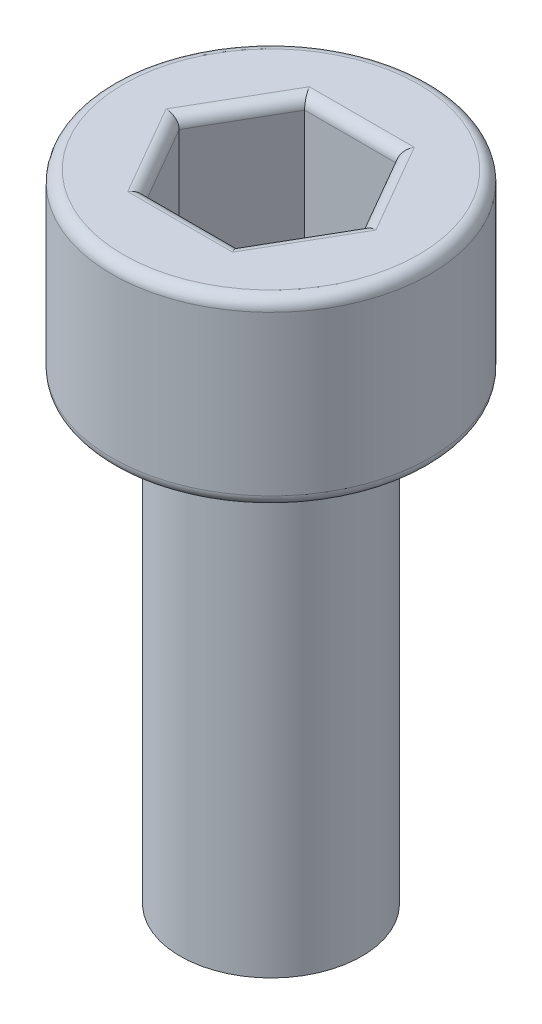
ISO-10303-21;
HEADER;
FILE_DESCRIPTION(('STEP AP214'),'2;1');
FILE_NAME('part.step','',(''),(''),'','','');
FILE_SCHEMA(('AUTOMOTIVE_DESIGN { 1 0 10303 214 1 1 1 1 }'));
ENDSEC;
DATA;
#1=APPLICATION_CONTEXT('core data for automotive mechanical design processes');
#2=APPLICATION_PROTOCOL_DEFINITION('international standard','automotive_design',2000,#1);
#3=PRODUCT_CONTEXT('',#1,'mechanical');
#4=PRODUCT('Part','Part','',(#3));
#5=PRODUCT_RELATED_PRODUCT_CATEGORY('part','',(#4));
#6=PRODUCT_DEFINITION_FORMATION('','',#4);
#7=PRODUCT_DEFINITION_CONTEXT('part definition',#1,'design');
#8=PRODUCT_DEFINITION('design','',#6,#7);
#9=PRODUCT_DEFINITION_SHAPE('','',#8);
#10=(LENGTH_UNIT() NAMED_UNIT(*) SI_UNIT(.MILLI.,.METRE.));
#11=(NAMED_UNIT(*) PLANE_ANGLE_UNIT() SI_UNIT($,.RADIAN.));
#12=(NAMED_UNIT(*) SI_UNIT($,.STERADIAN.) SOLID_ANGLE_UNIT());
#13=UNCERTAINTY_MEASURE_WITH_UNIT(LENGTH_MEASURE(1.E-05),#10,'distance_accuracy_value','');
#14=(GEOMETRIC_REPRESENTATION_CONTEXT(3) GLOBAL_UNCERTAINTY_ASSIGNED_CONTEXT((#13)) GLOBAL_UNIT_ASSIGNED_CONTEXT((#10,
#11,#12)) REPRESENTATION_CONTEXT('',''));
#15=CARTESIAN_POINT('',(0.,0.,0.));
#16=DIRECTION('',(0.,0.,1.));
#17=DIRECTION('',(1.,0.,0.));
#18=AXIS2_PLACEMENT_3D('',#15,#16,#17);
#19=CARTESIAN_POINT('',(2.44935223975043E-11,4.,0.));
#20=DIRECTION('',(0.,-1.,0.));
#21=DIRECTION('',(1.,0.,0.));
#22=AXIS2_PLACEMENT_3D('',#19,#20,#21);
#23=PLANE('',#22);
#24=CARTESIAN_POINT('',(0.,4.,0.));
#25=DIRECTION('',(0.,-1.,0.));
#26=DIRECTION('',(1.,0.,0.));
#27=AXIS2_PLACEMENT_3D('',#24,#25,#26);
#28=CIRCLE('',#27,3.25000000002449);
#29=CARTESIAN_POINT('',(3.25000000002449,4.,0.));
#30=VERTEX_POINT('',#29);
#31=EDGE_CURVE('E179',#30,#30,#28,.F.);
#32=ORIENTED_EDGE('',*,*,#31,.T.);
#33=EDGE_LOOP('',(#32));
#34=FACE_BOUND('',#33,.T.);
#35=DIRECTION('',(-0.5,0.,0.866025403784439));
#36=VECTOR('',#35,1.);
#37=CARTESIAN_POINT('',(-1.73205080756275,4.,-1.00000000001061));
#38=LINE('',#37,#36);
#39=CARTESIAN_POINT('',(-2.3094010767585,4.,0.));
#40=VERTEX_POINT('',#39);
#41=CARTESIAN_POINT('',(-1.15470053837925,4.,-2.));
#42=VERTEX_POINT('',#41);
#43=EDGE_CURVE('E174',#40,#42,#38,.F.);
#44=ORIENTED_EDGE('',*,*,#43,.T.);
#45=DIRECTION('',(-1.,0.,0.));
#46=VECTOR('',#45,1.);
#47=CARTESIAN_POINT('',(2.44941662466181E-11,4.,-2.));
#48=LINE('',#47,#46);
#49=CARTESIAN_POINT('',(1.15470053837925,4.,-2.));
#50=VERTEX_POINT('',#49);
#51=EDGE_CURVE('E176',#42,#50,#48,.F.);
#52=ORIENTED_EDGE('',*,*,#51,.T.);
#53=DIRECTION('',(-0.5,0.,-0.866025403784439));
#54=VECTOR('',#53,1.);
#55=CARTESIAN_POINT('',(1.732050807575,4.,-0.999999999989394));
#56=LINE('',#55,#54);
#57=CARTESIAN_POINT('',(2.3094010767585,4.,0.));
#58=VERTEX_POINT('',#57);
#59=EDGE_CURVE('E166',#50,#58,#56,.F.);
#60=ORIENTED_EDGE('',*,*,#59,.T.);
#61=DIRECTION('',(0.5,0.,-0.866025403784439));
#62=VECTOR('',#61,1.);
#63=CARTESIAN_POINT('',(1.732050807575,4.,0.999999999989394));
#64=LINE('',#63,#62);
#65=CARTESIAN_POINT('',(1.15470053837925,4.,2.));
#66=VERTEX_POINT('',#65);
#67=EDGE_CURVE('E168',#58,#66,#64,.F.);
#68=ORIENTED_EDGE('',*,*,#67,.T.);
#69=DIRECTION('',(1.,0.,0.));
#70=VECTOR('',#69,1.);
#71=CARTESIAN_POINT('',(2.44924493156481E-11,4.,2.));
#72=LINE('',#71,#70);
#73=CARTESIAN_POINT('',(-1.15470053837925,4.,2.));
#74=VERTEX_POINT('',#73);
#75=EDGE_CURVE('E170',#66,#74,#72,.F.);
#76=ORIENTED_EDGE('',*,*,#75,.T.);
#77=DIRECTION('',(0.5,0.,0.866025403784439));
#78=VECTOR('',#77,1.);
#79=CARTESIAN_POINT('',(-1.73205080756276,4.,1.00000000001061));
#80=LINE('',#79,#78);
#81=EDGE_CURVE('E172',#74,#40,#80,.F.);
#82=ORIENTED_EDGE('',*,*,#81,.T.);
#83=EDGE_LOOP('',(#44,#52,#60,#68,#76,#82));
#84=FACE_BOUND('',#83,.T.);
#85=ADVANCED_FACE('F33',(#34,#84),#23,.F.);
#86=CARTESIAN_POINT('',(0.,21.3223243250921,0.));
#87=DIRECTION('',(0.,1.,0.));
#88=DIRECTION('',(-1.,0.,0.));
#89=AXIS2_PLACEMENT_3D('',#86,#87,#88);
#90=CYLINDRICAL_SURFACE('',#89,3.50000000002449);
#91=CARTESIAN_POINT('',(0.,0.25,0.));
#92=DIRECTION('',(0.,1.,0.));
#93=DIRECTION('',(-1.,0.,0.));
#94=AXIS2_PLACEMENT_3D('',#91,#92,#93);
#95=CIRCLE('',#94,3.50000000002449);
#96=CARTESIAN_POINT('',(-3.50000000002449,0.25,0.));
#97=VERTEX_POINT('',#96);
#98=EDGE_CURVE('E163',#97,#97,#95,.T.);
#99=ORIENTED_EDGE('',*,*,#98,.T.);
#100=EDGE_LOOP('',(#99));
#101=FACE_BOUND('',#100,.T.);
#102=CARTESIAN_POINT('',(0.,3.75,0.));
#103=DIRECTION('',(0.,-1.,0.));
#104=DIRECTION('',(1.,0.,0.));
#105=AXIS2_PLACEMENT_3D('',#102,#103,#104);
#106=CIRCLE('',#105,3.50000000002449);
#107=CARTESIAN_POINT('',(3.50000000002449,3.75,0.));
#108=VERTEX_POINT('',#107);
#109=EDGE_CURVE('E160',#108,#108,#106,.T.);
#110=ORIENTED_EDGE('',*,*,#109,.T.);
#111=EDGE_LOOP('',(#110));
#112=FACE_BOUND('',#111,.T.);
#113=ADVANCED_FACE('F240',(#101,#112),#90,.T.);
#114=CARTESIAN_POINT('',(3.50000000002449,0.,0.));
#115=DIRECTION('',(0.,1.,0.));
#116=DIRECTION('',(-1.,0.,0.));
#117=AXIS2_PLACEMENT_3D('',#114,#115,#116);
#118=PLANE('',#117);
#119=CARTESIAN_POINT('',(0.,0.,0.));
#120=DIRECTION('',(0.,1.,0.));
#121=DIRECTION('',(-1.,0.,0.));
#122=AXIS2_PLACEMENT_3D('',#119,#120,#121);
#123=CIRCLE('',#122,2.25);
#124=CARTESIAN_POINT('',(-2.25,0.,0.));
#125=VERTEX_POINT('',#124);
#126=EDGE_CURVE('E154',#125,#125,#123,.T.);
#127=ORIENTED_EDGE('',*,*,#126,.T.);
#128=EDGE_LOOP('',(#127));
#129=FACE_BOUND('',#128,.T.);
#130=CARTESIAN_POINT('',(0.,0.,0.));
#131=DIRECTION('',(0.,1.,0.));
#132=DIRECTION('',(-1.,0.,0.));
#133=AXIS2_PLACEMENT_3D('',#130,#131,#132);
#134=CIRCLE('',#133,3.25000000002449);
#135=CARTESIAN_POINT('',(-3.25000000002449,0.,0.));
#136=VERTEX_POINT('',#135);
#137=EDGE_CURVE('E151',#136,#136,#134,.F.);
#138=ORIENTED_EDGE('',*,*,#137,.T.);
#139=EDGE_LOOP('',(#138));
#140=FACE_BOUND('',#139,.T.);
#141=ADVANCED_FACE('F246',(#129,#140),#118,.F.);
#142=CARTESIAN_POINT('',(0.,21.3223243250921,0.));
#143=DIRECTION('',(0.,1.,0.));
#144=DIRECTION('',(-1.,0.,0.));
#145=AXIS2_PLACEMENT_3D('',#142,#143,#144);
#146=CYLINDRICAL_SURFACE('',#145,2.);
#147=CARTESIAN_POINT('',(0.,-0.25,0.));
#148=DIRECTION('',(0.,1.,0.));
#149=DIRECTION('',(-1.,0.,0.));
#150=AXIS2_PLACEMENT_3D('',#147,#148,#149);
#151=CIRCLE('',#150,2.);
#152=CARTESIAN_POINT('',(-2.,-0.25,0.));
#153=VERTEX_POINT('',#152);
#154=EDGE_CURVE('E157',#153,#153,#151,.F.);
#155=ORIENTED_EDGE('',*,*,#154,.T.);
#156=EDGE_LOOP('',(#155));
#157=FACE_BOUND('',#156,.T.);
#158=CARTESIAN_POINT('',(0.,-10.,0.));
#159=DIRECTION('',(0.,1.,0.));
#160=DIRECTION('',(-1.,0.,0.));
#161=AXIS2_PLACEMENT_3D('',#158,#159,#160);
#162=CIRCLE('',#161,2.);
#163=CARTESIAN_POINT('',(-2.,-10.,0.));
#164=VERTEX_POINT('',#163);
#165=EDGE_CURVE('E139',#164,#164,#162,.T.);
#166=ORIENTED_EDGE('',*,*,#165,.T.);
#167=EDGE_LOOP('',(#166));
#168=FACE_BOUND('',#167,.T.);
#169=ADVANCED_FACE('F338',(#157,#168),#146,.T.);
#170=CARTESIAN_POINT('',(2.,-10.,0.));
#171=DIRECTION('',(0.,1.,0.));
#172=DIRECTION('',(-1.,0.,0.));
#173=AXIS2_PLACEMENT_3D('',#170,#171,#172);
#174=PLANE('',#173);
#175=ORIENTED_EDGE('',*,*,#165,.F.);
#176=EDGE_LOOP('',(#175));
#177=FACE_BOUND('',#176,.T.);
#178=ADVANCED_FACE('F236',(#177),#174,.F.);
#179=CARTESIAN_POINT('',(1.01036297108184,1.,1.75));
#180=DIRECTION('',(0.866025403784439,0.,0.5));
#181=DIRECTION('',(0.5,0.,-0.866025403784439));
#182=AXIS2_PLACEMENT_3D('',#179,#180,#181);
#183=PLANE('',#182);
#184=DIRECTION('',(0.,1.,0.));
#185=VECTOR('',#184,1.);
#186=CARTESIAN_POINT('',(1.01036297108184,1.,1.75));
#187=LINE('',#186,#185);
#188=CARTESIAN_POINT('',(1.01036297108184,1.,1.75));
#189=VERTEX_POINT('',#188);
#190=CARTESIAN_POINT('',(1.01036297108184,3.75,1.75));
#191=VERTEX_POINT('',#190);
#192=EDGE_CURVE('E137',#189,#191,#187,.T.);
#193=ORIENTED_EDGE('',*,*,#192,.T.);
#194=DIRECTION('',(0.5,0.,-0.866025403784439));
#195=VECTOR('',#194,1.);
#196=CARTESIAN_POINT('',(1.01036297108184,3.75,1.75));
#197=LINE('',#196,#195);
#198=CARTESIAN_POINT('',(2.02072594216369,3.75,0.));
#199=VERTEX_POINT('',#198);
#200=EDGE_CURVE('E42',#191,#199,#197,.T.);
#201=ORIENTED_EDGE('',*,*,#200,.T.);
#202=DIRECTION('',(0.,1.,0.));
#203=VECTOR('',#202,1.);
#204=CARTESIAN_POINT('',(2.02072594216369,1.,0.));
#205=LINE('',#204,#203);
#206=CARTESIAN_POINT('',(2.02072594216369,1.,0.));
#207=VERTEX_POINT('',#206);
#208=EDGE_CURVE('E103',#207,#199,#205,.T.);
#209=ORIENTED_EDGE('',*,*,#208,.F.);
#210=DIRECTION('',(0.5,0.,-0.866025403784439));
#211=VECTOR('',#210,1.);
#212=CARTESIAN_POINT('',(1.01036297108184,1.,1.75));
#213=LINE('',#212,#211);
#214=EDGE_CURVE('E107',#189,#207,#213,.T.);
#215=ORIENTED_EDGE('',*,*,#214,.F.);
#216=EDGE_LOOP('',(#193,#201,#209,#215));
#217=FACE_BOUND('',#216,.T.);
#218=ADVANCED_FACE('F105',(#217),#183,.F.);
#219=CARTESIAN_POINT('',(-1.01036297108185,1.,1.75));
#220=DIRECTION('',(0.,0.,1.));
#221=DIRECTION('',(1.,0.,0.));
#222=AXIS2_PLACEMENT_3D('',#219,#220,#221);
#223=PLANE('',#222);
#224=DIRECTION('',(0.,1.,0.));
#225=VECTOR('',#224,1.);
#226=CARTESIAN_POINT('',(-1.01036297108185,1.,1.75));
#227=LINE('',#226,#225);
#228=CARTESIAN_POINT('',(-1.01036297108185,1.,1.75));
#229=VERTEX_POINT('',#228);
#230=CARTESIAN_POINT('',(-1.01036297108185,3.75,1.75));
#231=VERTEX_POINT('',#230);
#232=EDGE_CURVE('E140',#229,#231,#227,.T.);
#233=ORIENTED_EDGE('',*,*,#232,.T.);
#234=DIRECTION('',(1.,0.,0.));
#235=VECTOR('',#234,1.);
#236=CARTESIAN_POINT('',(-1.01036297108185,3.75,1.75));
#237=LINE('',#236,#235);
#238=EDGE_CURVE('E57',#231,#191,#237,.T.);
#239=ORIENTED_EDGE('',*,*,#238,.T.);
#240=ORIENTED_EDGE('',*,*,#192,.F.);
#241=DIRECTION('',(1.,0.,0.));
#242=VECTOR('',#241,1.);
#243=CARTESIAN_POINT('',(-1.01036297108185,1.,1.75));
#244=LINE('',#243,#242);
#245=EDGE_CURVE('E112',#229,#189,#244,.T.);
#246=ORIENTED_EDGE('',*,*,#245,.F.);
#247=EDGE_LOOP('',(#233,#239,#240,#246));
#248=FACE_BOUND('',#247,.T.);
#249=ADVANCED_FACE('F228',(#248),#223,.F.);
#250=CARTESIAN_POINT('',(-2.02072594216369,1.,0.));
#251=DIRECTION('',(-0.866025403784439,0.,0.5));
#252=DIRECTION('',(0.5,0.,0.866025403784439));
#253=AXIS2_PLACEMENT_3D('',#250,#251,#252);
#254=PLANE('',#253);
#255=DIRECTION('',(0.,1.,0.));
#256=VECTOR('',#255,1.);
#257=CARTESIAN_POINT('',(-2.02072594216369,1.,0.));
#258=LINE('',#257,#256);
#259=CARTESIAN_POINT('',(-2.02072594216369,1.,0.));
#260=VERTEX_POINT('',#259);
#261=CARTESIAN_POINT('',(-2.02072594216369,3.75,0.));
#262=VERTEX_POINT('',#261);
#263=EDGE_CURVE('E142',#260,#262,#258,.T.);
#264=ORIENTED_EDGE('',*,*,#263,.T.);
#265=DIRECTION('',(0.5,0.,0.866025403784439));
#266=VECTOR('',#265,1.);
#267=CARTESIAN_POINT('',(-2.02072594216369,3.75,0.));
#268=LINE('',#267,#266);
#269=EDGE_CURVE('E187',#262,#231,#268,.T.);
#270=ORIENTED_EDGE('',*,*,#269,.T.);
#271=ORIENTED_EDGE('',*,*,#232,.F.);
#272=DIRECTION('',(0.5,0.,0.866025403784439));
#273=VECTOR('',#272,1.);
#274=CARTESIAN_POINT('',(-2.02072594216369,1.,0.));
#275=LINE('',#274,#273);
#276=EDGE_CURVE('E134',#260,#229,#275,.T.);
#277=ORIENTED_EDGE('',*,*,#276,.F.);
#278=EDGE_LOOP('',(#264,#270,#271,#277));
#279=FACE_BOUND('',#278,.T.);
#280=ADVANCED_FACE('F227',(#279),#254,.F.);
#281=CARTESIAN_POINT('',(-1.01036297108185,1.,-1.75));
#282=DIRECTION('',(-0.866025403784439,0.,-0.5));
#283=DIRECTION('',(-0.5,0.,0.866025403784439));
#284=AXIS2_PLACEMENT_3D('',#281,#282,#283);
#285=PLANE('',#284);
#286=DIRECTION('',(0.,1.,0.));
#287=VECTOR('',#286,1.);
#288=CARTESIAN_POINT('',(-1.01036297108185,1.,-1.75));
#289=LINE('',#288,#287);
#290=CARTESIAN_POINT('',(-1.01036297108185,1.,-1.75));
#291=VERTEX_POINT('',#290);
#292=CARTESIAN_POINT('',(-1.01036297108185,3.75,-1.75));
#293=VERTEX_POINT('',#292);
#294=EDGE_CURVE('E145',#291,#293,#289,.T.);
#295=ORIENTED_EDGE('',*,*,#294,.T.);
#296=DIRECTION('',(-0.5,0.,0.866025403784439));
#297=VECTOR('',#296,1.);
#298=CARTESIAN_POINT('',(-1.01036297108185,3.75,-1.75));
#299=LINE('',#298,#297);
#300=EDGE_CURVE('E185',#293,#262,#299,.T.);
#301=ORIENTED_EDGE('',*,*,#300,.T.);
#302=ORIENTED_EDGE('',*,*,#263,.F.);
#303=DIRECTION('',(-0.5,0.,0.866025403784439));
#304=VECTOR('',#303,1.);
#305=CARTESIAN_POINT('',(-1.01036297108185,1.,-1.75));
#306=LINE('',#305,#304);
#307=EDGE_CURVE('E131',#291,#260,#306,.T.);
#308=ORIENTED_EDGE('',*,*,#307,.F.);
#309=EDGE_LOOP('',(#295,#301,#302,#308));
#310=FACE_BOUND('',#309,.T.);
#311=ADVANCED_FACE('F224',(#310),#285,.F.);
#312=CARTESIAN_POINT('',(1.01036297108185,1.,-1.75));
#313=DIRECTION('',(0.,0.,-1.));
#314=DIRECTION('',(-1.,0.,0.));
#315=AXIS2_PLACEMENT_3D('',#312,#313,#314);
#316=PLANE('',#315);
#317=DIRECTION('',(0.,1.,0.));
#318=VECTOR('',#317,1.);
#319=CARTESIAN_POINT('',(1.01036297108185,1.,-1.75));
#320=LINE('',#319,#318);
#321=CARTESIAN_POINT('',(1.01036297108185,1.,-1.75));
#322=VERTEX_POINT('',#321);
#323=CARTESIAN_POINT('',(1.01036297108184,3.75,-1.75));
#324=VERTEX_POINT('',#323);
#325=EDGE_CURVE('E111',#322,#324,#320,.T.);
#326=ORIENTED_EDGE('',*,*,#325,.T.);
#327=DIRECTION('',(-1.,0.,0.));
#328=VECTOR('',#327,1.);
#329=CARTESIAN_POINT('',(1.01036297108184,3.75,-1.75));
#330=LINE('',#329,#328);
#331=EDGE_CURVE('E182',#324,#293,#330,.T.);
#332=ORIENTED_EDGE('',*,*,#331,.T.);
#333=ORIENTED_EDGE('',*,*,#294,.F.);
#334=DIRECTION('',(-1.,0.,0.));
#335=VECTOR('',#334,1.);
#336=CARTESIAN_POINT('',(1.01036297108185,1.,-1.75));
#337=LINE('',#336,#335);
#338=EDGE_CURVE('E121',#322,#291,#337,.T.);
#339=ORIENTED_EDGE('',*,*,#338,.F.);
#340=EDGE_LOOP('',(#326,#332,#333,#339));
#341=FACE_BOUND('',#340,.T.);
#342=ADVANCED_FACE('F220',(#341),#316,.F.);
#343=CARTESIAN_POINT('',(2.02072594216369,1.,0.));
#344=DIRECTION('',(0.866025403784439,0.,-0.5));
#345=DIRECTION('',(-0.5,0.,-0.866025403784439));
#346=AXIS2_PLACEMENT_3D('',#343,#344,#345);
#347=PLANE('',#346);
#348=ORIENTED_EDGE('',*,*,#208,.T.);
#349=DIRECTION('',(-0.5,0.,-0.866025403784439));
#350=VECTOR('',#349,1.);
#351=CARTESIAN_POINT('',(2.02072594216369,3.75,0.));
#352=LINE('',#351,#350);
#353=EDGE_CURVE('E11',#199,#324,#352,.T.);
#354=ORIENTED_EDGE('',*,*,#353,.T.);
#355=ORIENTED_EDGE('',*,*,#325,.F.);
#356=DIRECTION('',(-0.5,0.,-0.866025403784439));
#357=VECTOR('',#356,1.);
#358=CARTESIAN_POINT('',(2.02072594216369,1.,0.));
#359=LINE('',#358,#357);
#360=EDGE_CURVE('E115',#207,#322,#359,.T.);
#361=ORIENTED_EDGE('',*,*,#360,.F.);
#362=EDGE_LOOP('',(#348,#354,#355,#361));
#363=FACE_BOUND('',#362,.T.);
#364=ADVANCED_FACE('F116',(#363),#347,.F.);
#365=CARTESIAN_POINT('',(0.,1.,0.));
#366=DIRECTION('',(0.,1.,0.));
#367=DIRECTION('',(0.,0.,1.));
#368=AXIS2_PLACEMENT_3D('',#365,#366,#367);
#369=PLANE('',#368);
#370=ORIENTED_EDGE('',*,*,#214,.T.);
#371=ORIENTED_EDGE('',*,*,#360,.T.);
#372=ORIENTED_EDGE('',*,*,#338,.T.);
#373=ORIENTED_EDGE('',*,*,#307,.T.);
#374=ORIENTED_EDGE('',*,*,#276,.T.);
#375=ORIENTED_EDGE('',*,*,#245,.T.);
#376=EDGE_LOOP('',(#370,#371,#372,#373,#374,#375));
#377=FACE_BOUND('',#376,.T.);
#378=ADVANCED_FACE('F123',(#377),#369,.T.);
#379=CARTESIAN_POINT('',(0.,-0.25,0.));
#380=DIRECTION('',(0.,1.,0.));
#381=DIRECTION('',(-1.,0.,0.));
#382=AXIS2_PLACEMENT_3D('',#379,#380,#381);
#383=TOROIDAL_SURFACE('',#382,2.25,0.25);
#384=ORIENTED_EDGE('',*,*,#154,.F.);
#385=EDGE_LOOP('',(#384));
#386=FACE_BOUND('',#385,.T.);
#387=ORIENTED_EDGE('',*,*,#126,.F.);
#388=EDGE_LOOP('',(#387));
#389=FACE_BOUND('',#388,.T.);
#390=ADVANCED_FACE('F252',(#386,#389),#383,.F.);
#391=CARTESIAN_POINT('',(0.,0.25,0.));
#392=DIRECTION('',(0.,1.,0.));
#393=DIRECTION('',(-1.,0.,0.));
#394=AXIS2_PLACEMENT_3D('',#391,#392,#393);
#395=TOROIDAL_SURFACE('',#394,3.25000000002449,0.25);
#396=ORIENTED_EDGE('',*,*,#137,.F.);
#397=EDGE_LOOP('',(#396));
#398=FACE_BOUND('',#397,.T.);
#399=ORIENTED_EDGE('',*,*,#98,.F.);
#400=EDGE_LOOP('',(#399));
#401=FACE_BOUND('',#400,.T.);
#402=ADVANCED_FACE('F255',(#398,#401),#395,.T.);
#403=CARTESIAN_POINT('',(0.,3.75,0.));
#404=DIRECTION('',(0.,-1.,0.));
#405=DIRECTION('',(1.,0.,0.));
#406=AXIS2_PLACEMENT_3D('',#403,#404,#405);
#407=TOROIDAL_SURFACE('',#406,3.25000000002449,0.25);
#408=ORIENTED_EDGE('',*,*,#109,.F.);
#409=EDGE_LOOP('',(#408));
#410=FACE_BOUND('',#409,.T.);
#411=ORIENTED_EDGE('',*,*,#31,.F.);
#412=EDGE_LOOP('',(#411));
#413=FACE_BOUND('',#412,.T.);
#414=ADVANCED_FACE('F259',(#410,#413),#407,.T.);
#415=CARTESIAN_POINT('',(-1.01036297108185,3.75,2.));
#416=DIRECTION('',(1.,0.,0.));
#417=DIRECTION('',(0.,0.,-1.));
#418=AXIS2_PLACEMENT_3D('',#415,#416,#417);
#419=CYLINDRICAL_SURFACE('',#418,0.25);
#420=CARTESIAN_POINT('',(-1.15470053837925,3.75,2.));
#421=DIRECTION('',(0.866025403784438,0.,0.500000000000001));
#422=DIRECTION('',(-0.5,0.,0.866025403784438));
#423=AXIS2_PLACEMENT_3D('',#420,#421,#422);
#424=ELLIPSE('',#423,0.288675134594813,0.25);
#425=EDGE_CURVE('E128',#74,#231,#424,.F.);
#426=ORIENTED_EDGE('',*,*,#425,.F.);
#427=ORIENTED_EDGE('',*,*,#75,.F.);
#428=CARTESIAN_POINT('',(1.15470053837925,3.75,2.));
#429=DIRECTION('',(0.866025403784439,0.,-0.5));
#430=DIRECTION('',(0.5,0.,0.866025403784439));
#431=AXIS2_PLACEMENT_3D('',#428,#429,#430);
#432=ELLIPSE('',#431,0.288675134594813,0.25);
#433=EDGE_CURVE('E37',#191,#66,#432,.T.);
#434=ORIENTED_EDGE('',*,*,#433,.F.);
#435=ORIENTED_EDGE('',*,*,#238,.F.);
#436=EDGE_LOOP('',(#426,#427,#434,#435));
#437=FACE_BOUND('',#436,.T.);
#438=ADVANCED_FACE('F35',(#437),#419,.T.);
#439=CARTESIAN_POINT('',(1.22686932202795,3.75,1.875));
#440=DIRECTION('',(0.5,0.,-0.866025403784439));
#441=DIRECTION('',(-0.866025403784439,0.,-0.5));
#442=AXIS2_PLACEMENT_3D('',#439,#440,#441);
#443=CYLINDRICAL_SURFACE('',#442,0.25);
#444=ORIENTED_EDGE('',*,*,#433,.T.);
#445=ORIENTED_EDGE('',*,*,#67,.F.);
#446=CARTESIAN_POINT('',(2.3094010767585,3.75,0.));
#447=DIRECTION('',(0.,0.,-1.));
#448=DIRECTION('',(1.,0.,0.));
#449=AXIS2_PLACEMENT_3D('',#446,#447,#448);
#450=ELLIPSE('',#449,0.288675134594813,0.25);
#451=EDGE_CURVE('E198',#199,#58,#450,.T.);
#452=ORIENTED_EDGE('',*,*,#451,.F.);
#453=ORIENTED_EDGE('',*,*,#200,.F.);
#454=EDGE_LOOP('',(#444,#445,#452,#453));
#455=FACE_BOUND('',#454,.T.);
#456=ADVANCED_FACE('F212',(#455),#443,.T.);
#457=CARTESIAN_POINT('',(-2.2372322931098,3.75,0.124999999999999));
#458=DIRECTION('',(0.5,0.,0.866025403784439));
#459=DIRECTION('',(0.866025403784439,0.,-0.5));
#460=AXIS2_PLACEMENT_3D('',#457,#458,#459);
#461=CYLINDRICAL_SURFACE('',#460,0.25);
#462=ORIENTED_EDGE('',*,*,#425,.T.);
#463=ORIENTED_EDGE('',*,*,#269,.F.);
#464=CARTESIAN_POINT('',(-2.3094010767585,3.75,0.));
#465=DIRECTION('',(0.,0.,1.));
#466=DIRECTION('',(-1.,0.,0.));
#467=AXIS2_PLACEMENT_3D('',#464,#465,#466);
#468=ELLIPSE('',#467,0.288675134594813,0.25);
#469=EDGE_CURVE('E195',#40,#262,#468,.F.);
#470=ORIENTED_EDGE('',*,*,#469,.F.);
#471=ORIENTED_EDGE('',*,*,#81,.F.);
#472=EDGE_LOOP('',(#462,#463,#470,#471));
#473=FACE_BOUND('',#472,.T.);
#474=ADVANCED_FACE('F205',(#473),#461,.T.);
#475=CARTESIAN_POINT('',(2.2372322931098,3.75,-0.125));
#476=DIRECTION('',(-0.5,0.,-0.866025403784439));
#477=DIRECTION('',(-0.866025403784439,0.,0.5));
#478=AXIS2_PLACEMENT_3D('',#475,#476,#477);
#479=CYLINDRICAL_SURFACE('',#478,0.25);
#480=ORIENTED_EDGE('',*,*,#451,.T.);
#481=ORIENTED_EDGE('',*,*,#59,.F.);
#482=CARTESIAN_POINT('',(1.15470053837925,3.75,-2.));
#483=DIRECTION('',(-0.866025403784438,0.,-0.5));
#484=DIRECTION('',(-0.5,0.,0.866025403784439));
#485=AXIS2_PLACEMENT_3D('',#482,#483,#484);
#486=ELLIPSE('',#485,0.288675134594813,0.25);
#487=EDGE_CURVE('E193',#324,#50,#486,.T.);
#488=ORIENTED_EDGE('',*,*,#487,.F.);
#489=ORIENTED_EDGE('',*,*,#353,.F.);
#490=EDGE_LOOP('',(#480,#481,#488,#489));
#491=FACE_BOUND('',#490,.T.);
#492=ADVANCED_FACE('F217',(#491),#479,.T.);
#493=CARTESIAN_POINT('',(-1.22686932202796,3.75,-1.875));
#494=DIRECTION('',(-0.5,0.,0.866025403784439));
#495=DIRECTION('',(0.866025403784439,0.,0.5));
#496=AXIS2_PLACEMENT_3D('',#493,#494,#495);
#497=CYLINDRICAL_SURFACE('',#496,0.25);
#498=ORIENTED_EDGE('',*,*,#469,.T.);
#499=ORIENTED_EDGE('',*,*,#300,.F.);
#500=CARTESIAN_POINT('',(-1.15470053837925,3.75,-2.));
#501=DIRECTION('',(-0.866025403784439,0.,0.5));
#502=DIRECTION('',(-0.5,0.,-0.866025403784439));
#503=AXIS2_PLACEMENT_3D('',#500,#501,#502);
#504=ELLIPSE('',#503,0.288675134594813,0.25);
#505=EDGE_CURVE('E191',#42,#293,#504,.F.);
#506=ORIENTED_EDGE('',*,*,#505,.F.);
#507=ORIENTED_EDGE('',*,*,#43,.F.);
#508=EDGE_LOOP('',(#498,#499,#506,#507));
#509=FACE_BOUND('',#508,.T.);
#510=ADVANCED_FACE('F267',(#509),#497,.T.);
#511=CARTESIAN_POINT('',(1.01036297108184,3.75,-2.));
#512=DIRECTION('',(-1.,0.,0.));
#513=DIRECTION('',(0.,0.,1.));
#514=AXIS2_PLACEMENT_3D('',#511,#512,#513);
#515=CYLINDRICAL_SURFACE('',#514,0.25);
#516=ORIENTED_EDGE('',*,*,#487,.T.);
#517=ORIENTED_EDGE('',*,*,#51,.F.);
#518=ORIENTED_EDGE('',*,*,#505,.T.);
#519=ORIENTED_EDGE('',*,*,#331,.F.);
#520=EDGE_LOOP('',(#516,#517,#518,#519));
#521=FACE_BOUND('',#520,.T.);
#522=ADVANCED_FACE('F264',(#521),#515,.T.);
#523=CLOSED_SHELL('',(#85,#113,#141,#169,#178,#218,#249,#280,#311,#342,#364,#378,#390,#402,#414,
#438,#456,#474,#492,#510,#522));
#524=MANIFOLD_SOLID_BREP('B2',#523);
#525=ADVANCED_BREP_SHAPE_REPRESENTATION('',(#18,#524),#14);
#526=SHAPE_DEFINITION_REPRESENTATION(#9,#525);
ENDSEC;
END-ISO-10303-21;
